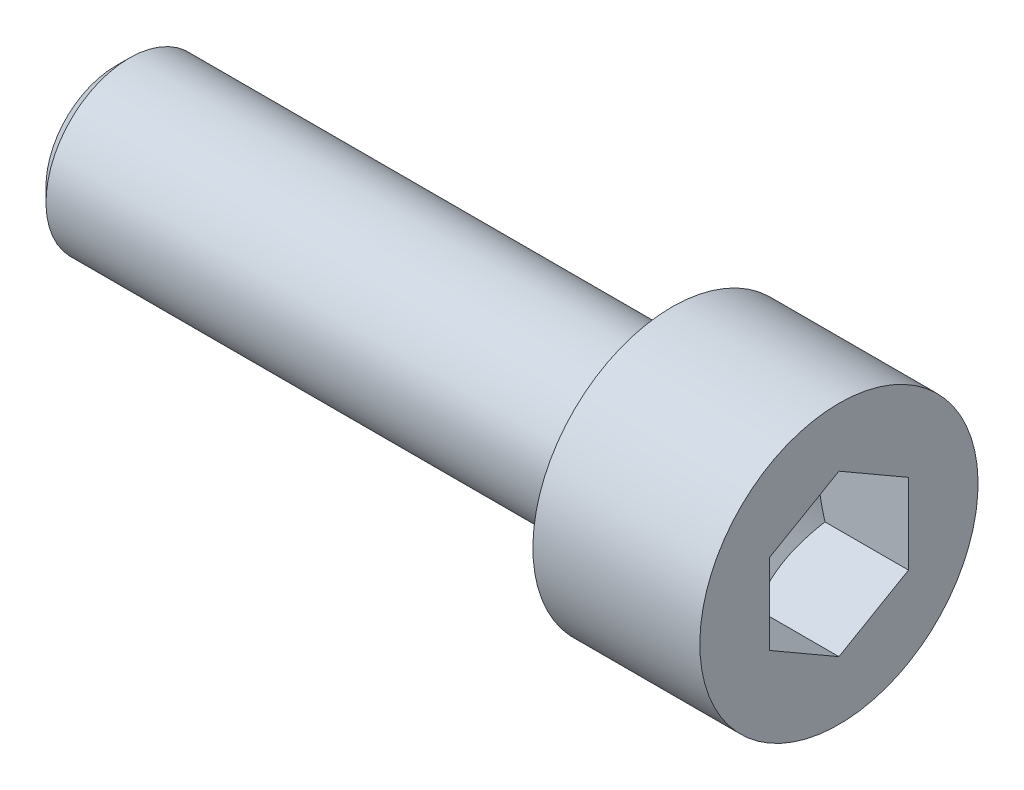
ISO-10303-21;
HEADER;
FILE_DESCRIPTION(('STEP AP214'),'2;1');
FILE_NAME('part.step','',(''),(''),'','','');
FILE_SCHEMA(('AUTOMOTIVE_DESIGN { 1 0 10303 214 1 1 1 1 }'));
ENDSEC;
DATA;
#1=APPLICATION_CONTEXT('core data for automotive mechanical design processes');
#2=APPLICATION_PROTOCOL_DEFINITION('international standard','automotive_design',2000,#1);
#3=PRODUCT_CONTEXT('',#1,'mechanical');
#4=PRODUCT('Part','Part','',(#3));
#5=PRODUCT_RELATED_PRODUCT_CATEGORY('part','',(#4));
#6=PRODUCT_DEFINITION_FORMATION('','',#4);
#7=PRODUCT_DEFINITION_CONTEXT('part definition',#1,'design');
#8=PRODUCT_DEFINITION('design','',#6,#7);
#9=PRODUCT_DEFINITION_SHAPE('','',#8);
#10=(LENGTH_UNIT() NAMED_UNIT(*) SI_UNIT(.MILLI.,.METRE.));
#11=(NAMED_UNIT(*) PLANE_ANGLE_UNIT() SI_UNIT($,.RADIAN.));
#12=(NAMED_UNIT(*) SI_UNIT($,.STERADIAN.) SOLID_ANGLE_UNIT());
#13=UNCERTAINTY_MEASURE_WITH_UNIT(LENGTH_MEASURE(1.E-05),#10,'distance_accuracy_value','');
#14=(GEOMETRIC_REPRESENTATION_CONTEXT(3) GLOBAL_UNCERTAINTY_ASSIGNED_CONTEXT((#13)) GLOBAL_UNIT_ASSIGNED_CONTEXT((#10,
#11,#12)) REPRESENTATION_CONTEXT('',''));
#15=CARTESIAN_POINT('',(0.,0.,0.));
#16=DIRECTION('',(0.,0.,1.));
#17=DIRECTION('',(1.,0.,0.));
#18=AXIS2_PLACEMENT_3D('',#15,#16,#17);
#19=CARTESIAN_POINT('',(-25.9,0.,0.));
#20=DIRECTION('',(1.,0.,0.));
#21=DIRECTION('',(0.,1.,0.));
#22=AXIS2_PLACEMENT_3D('',#19,#20,#21);
#23=CYLINDRICAL_SURFACE('',#22,2.5);
#24=CARTESIAN_POINT('',(-6.92,0.,0.));
#25=DIRECTION('',(1.,0.,0.));
#26=DIRECTION('',(0.,1.,0.));
#27=AXIS2_PLACEMENT_3D('',#24,#25,#26);
#28=CIRCLE('',#27,2.5);
#29=CARTESIAN_POINT('',(-6.92,2.5,0.));
#30=VERTEX_POINT('',#29);
#31=EDGE_CURVE('P0_E11',#30,#30,#28,.T.);
#32=ORIENTED_EDGE('',*,*,#31,.T.);
#33=EDGE_LOOP('',(#32));
#34=FACE_BOUND('',#33,.T.);
#35=CARTESIAN_POINT('',(-25.9,0.,0.));
#36=DIRECTION('',(1.,0.,0.));
#37=DIRECTION('',(0.,1.,0.));
#38=AXIS2_PLACEMENT_3D('',#35,#36,#37);
#39=CIRCLE('',#38,2.5);
#40=CARTESIAN_POINT('',(-25.9,2.5,0.));
#41=VERTEX_POINT('',#40);
#42=EDGE_CURVE('P0_E53',#41,#41,#39,.T.);
#43=ORIENTED_EDGE('',*,*,#42,.F.);
#44=EDGE_LOOP('',(#43));
#45=FACE_BOUND('',#44,.T.);
#46=ADVANCED_FACE('P0_F16',(#34,#45),#23,.F.);
#47=CARTESIAN_POINT('',(-6.92,-3.30000000001571,-3.30000000001571));
#48=DIRECTION('',(1.,0.,0.));
#49=DIRECTION('',(0.,1.,0.));
#50=AXIS2_PLACEMENT_3D('',#47,#48,#49);
#51=PLANE('',#50);
#52=CARTESIAN_POINT('',(-6.92,0.,0.));
#53=DIRECTION('',(1.,0.,0.));
#54=DIRECTION('',(0.,1.,0.));
#55=AXIS2_PLACEMENT_3D('',#52,#53,#54);
#56=CIRCLE('',#55,3.00000000001428);
#57=CARTESIAN_POINT('',(-6.92,3.00000000001428,0.));
#58=VERTEX_POINT('',#57);
#59=EDGE_CURVE('P0_E24',#58,#58,#56,.T.);
#60=ORIENTED_EDGE('',*,*,#59,.T.);
#61=EDGE_LOOP('',(#60));
#62=FACE_BOUND('',#61,.T.);
#63=ORIENTED_EDGE('',*,*,#31,.F.);
#64=EDGE_LOOP('',(#63));
#65=FACE_BOUND('',#64,.T.);
#66=ADVANCED_FACE('P0_F78',(#62,#65),#51,.T.);
#67=CARTESIAN_POINT('',(-25.3999999999858,0.,0.));
#68=DIRECTION('',(1.,0.,0.));
#69=DIRECTION('',(0.,1.,0.));
#70=AXIS2_PLACEMENT_3D('',#67,#68,#69);
#71=CYLINDRICAL_SURFACE('',#70,3.00000000001429);
#72=CARTESIAN_POINT('',(-25.3999999999858,0.,0.));
#73=DIRECTION('',(-1.,0.,0.));
#74=DIRECTION('',(0.,1.,0.));
#75=AXIS2_PLACEMENT_3D('',#72,#73,#74);
#76=CIRCLE('',#75,3.00000000001431);
#77=CARTESIAN_POINT('',(-25.3999999999858,3.00000000001431,0.));
#78=VERTEX_POINT('',#77);
#79=EDGE_CURVE('P0_E49',#78,#78,#76,.T.);
#80=ORIENTED_EDGE('',*,*,#79,.F.);
#81=EDGE_LOOP('',(#80));
#82=FACE_BOUND('',#81,.T.);
#83=ORIENTED_EDGE('',*,*,#59,.F.);
#84=EDGE_LOOP('',(#83));
#85=FACE_BOUND('',#84,.T.);
#86=ADVANCED_FACE('P0_F69',(#82,#85),#71,.T.);
#87=CARTESIAN_POINT('',(-25.9,0.,0.));
#88=DIRECTION('',(1.,0.,0.));
#89=DIRECTION('',(0.,1.,0.));
#90=AXIS2_PLACEMENT_3D('',#87,#88,#89);
#91=CONICAL_SURFACE('',#90,2.5,0.78539816250006);
#92=ORIENTED_EDGE('',*,*,#42,.T.);
#93=EDGE_LOOP('',(#92));
#94=FACE_BOUND('',#93,.T.);
#95=ORIENTED_EDGE('',*,*,#79,.T.);
#96=EDGE_LOOP('',(#95));
#97=FACE_BOUND('',#96,.T.);
#98=ADVANCED_FACE('P0_F50',(#94,#97),#91,.T.);
#99=CLOSED_SHELL('',(#46,#66,#86,#98));
#100=MANIFOLD_SOLID_BREP('P0_B1',#99);
#101=CARTESIAN_POINT('',(-6.92,-2.728,-2.728));
#102=DIRECTION('',(1.,0.,0.));
#103=DIRECTION('',(0.,1.,0.));
#104=AXIS2_PLACEMENT_3D('',#101,#102,#103);
#105=PLANE('',#104);
#106=CARTESIAN_POINT('',(-6.92,0.,0.));
#107=DIRECTION('',(1.,0.,0.));
#108=DIRECTION('',(0.,1.,0.));
#109=AXIS2_PLACEMENT_3D('',#106,#107,#108);
#110=CIRCLE('',#109,2.48);
#111=CARTESIAN_POINT('',(-6.92,2.48,0.));
#112=VERTEX_POINT('',#111);
#113=EDGE_CURVE('P1_E11',#112,#112,#110,.T.);
#114=ORIENTED_EDGE('',*,*,#113,.T.);
#115=EDGE_LOOP('',(#114));
#116=FACE_BOUND('',#115,.T.);
#117=ADVANCED_FACE('P1_F16',(#116),#105,.T.);
#118=CARTESIAN_POINT('',(-25.9,0.,0.));
#119=DIRECTION('',(1.,0.,0.));
#120=DIRECTION('',(0.,1.,0.));
#121=AXIS2_PLACEMENT_3D('',#118,#119,#120);
#122=CYLINDRICAL_SURFACE('',#121,2.48);
#123=CARTESIAN_POINT('',(-25.9,0.,0.));
#124=DIRECTION('',(-1.,0.,0.));
#125=DIRECTION('',(0.,1.,0.));
#126=AXIS2_PLACEMENT_3D('',#123,#124,#125);
#127=CIRCLE('',#126,2.48);
#128=CARTESIAN_POINT('',(-25.9,2.48,0.));
#129=VERTEX_POINT('',#128);
#130=EDGE_CURVE('P1_E24',#129,#129,#127,.T.);
#131=ORIENTED_EDGE('',*,*,#130,.F.);
#132=EDGE_LOOP('',(#131));
#133=FACE_BOUND('',#132,.T.);
#134=ORIENTED_EDGE('',*,*,#113,.F.);
#135=EDGE_LOOP('',(#134));
#136=FACE_BOUND('',#135,.T.);
#137=ADVANCED_FACE('P1_F50',(#133,#136),#122,.T.);
#138=CARTESIAN_POINT('',(-25.9,-2.728,2.728));
#139=DIRECTION('',(-1.,0.,0.));
#140=DIRECTION('',(0.,0.,1.));
#141=AXIS2_PLACEMENT_3D('',#138,#139,#140);
#142=PLANE('',#141);
#143=ORIENTED_EDGE('',*,*,#130,.T.);
#144=EDGE_LOOP('',(#143));
#145=FACE_BOUND('',#144,.T.);
#146=ADVANCED_FACE('P1_F38',(#145),#142,.T.);
#147=CLOSED_SHELL('',(#117,#137,#146));
#148=MANIFOLD_SOLID_BREP('P1_B1',#147);
#149=CARTESIAN_POINT('',(0.0999999999999716,1.44337567297414,2.50000000000008));
#150=DIRECTION('',(0.,0.866025403784447,0.499999999999986));
#151=DIRECTION('',(1.,0.,0.));
#152=AXIS2_PLACEMENT_3D('',#149,#150,#151);
#153=PLANE('',#152);
#154=DIRECTION('',(-1.,0.,0.));
#155=VECTOR('',#154,1.);
#156=CARTESIAN_POINT('',(0.0999999999999751,2.88675134594819,0.));
#157=LINE('',#156,#155);
#158=CARTESIAN_POINT('',(0.0999999999999751,2.88675134594814,0.));
#159=VERTEX_POINT('',#158);
#160=CARTESIAN_POINT('',(-2.9,2.88675134594818,0.));
#161=VERTEX_POINT('',#160);
#162=EDGE_CURVE('P2_E203',#159,#161,#157,.T.);
#163=ORIENTED_EDGE('',*,*,#162,.F.);
#164=DIRECTION('',(0.,0.499999999999992,-0.866025403784444));
#165=VECTOR('',#164,1.);
#166=CARTESIAN_POINT('',(0.0999999999999751,1.44337567297417,2.50000000000005));
#167=LINE('',#166,#165);
#168=CARTESIAN_POINT('',(0.0999999999999751,1.44337567297414,2.50000000000008));
#169=VERTEX_POINT('',#168);
#170=EDGE_CURVE('P2_E164',#169,#159,#167,.T.);
#171=ORIENTED_EDGE('',*,*,#170,.F.);
#172=DIRECTION('',(1.,0.,0.));
#173=VECTOR('',#172,1.);
#174=CARTESIAN_POINT('',(-2.9,1.44337567297417,2.50000000000005));
#175=LINE('',#174,#173);
#176=CARTESIAN_POINT('',(-2.9,1.44337567297414,2.50000000000008));
#177=VERTEX_POINT('',#176);
#178=EDGE_CURVE('P2_E174',#177,#169,#175,.T.);
#179=ORIENTED_EDGE('',*,*,#178,.F.);
#180=CARTESIAN_POINT('',(-2.9,2.88675134594823,0.));
#181=CARTESIAN_POINT('',(-3.3376297113811,2.1650635094612,1.25000000000003));
#182=CARTESIAN_POINT('',(-2.90000000000004,1.44337567297417,2.50000000000006));
#183=(BOUNDED_CURVE() B_SPLINE_CURVE(2,(#180,#181,#182),.UNSPECIFIED.,.F.,
.F.) B_SPLINE_CURVE_WITH_KNOTS((3,3),(0.,1.),
.UNSPECIFIED.) CURVE() GEOMETRIC_REPRESENTATION_ITEM() RATIONAL_B_SPLINE_CURVE((1.,
1.15470053837925,1.)) REPRESENTATION_ITEM(''));
#184=EDGE_CURVE('P2_E11',#161,#177,#183,.T.);
#185=ORIENTED_EDGE('',*,*,#184,.F.);
#186=EDGE_LOOP('',(#163,#171,#179,#185));
#187=FACE_BOUND('',#186,.T.);
#188=ADVANCED_FACE('P2_F16',(#187),#153,.F.);
#189=CARTESIAN_POINT('',(-3.65051884552429,0.,0.));
#190=DIRECTION('',(1.,0.,0.));
#191=DIRECTION('',(0.,1.,0.));
#192=AXIS2_PLACEMENT_3D('',#189,#190,#191);
#193=CONICAL_SURFACE('',#192,1.64908326791112,1.02568604338406);
#194=CARTESIAN_POINT('',(-2.9,1.44337567297399,-2.5000000000001));
#195=CARTESIAN_POINT('',(-3.33762971138116,2.16506350946111,-1.24999999999997));
#196=CARTESIAN_POINT('',(-2.9,2.88675134594823,1.51788304147971E-13));
#197=(BOUNDED_CURVE() B_SPLINE_CURVE(2,(#194,#195,#196),.UNSPECIFIED.,.F.,
.F.) B_SPLINE_CURVE_WITH_KNOTS((3,3),(0.,1.),
.UNSPECIFIED.) CURVE() GEOMETRIC_REPRESENTATION_ITEM() RATIONAL_B_SPLINE_CURVE((1.,
1.15470053837929,1.)) REPRESENTATION_ITEM(''));
#198=CARTESIAN_POINT('',(-2.9,1.44337567297403,-2.49999999999991));
#199=VERTEX_POINT('',#198);
#200=EDGE_CURVE('P2_E27',#199,#161,#197,.T.);
#201=ORIENTED_EDGE('',*,*,#200,.T.);
#202=ORIENTED_EDGE('',*,*,#184,.T.);
#203=CARTESIAN_POINT('',(-2.90000000000004,1.44337567297418,2.50000000000005));
#204=CARTESIAN_POINT('',(-3.33762971138111,1.02908550013496E-13,2.50000000000008));
#205=CARTESIAN_POINT('',(-2.90000000000006,-1.44337567297398,2.50000000000011));
#206=(BOUNDED_CURVE() B_SPLINE_CURVE(2,(#203,#204,#205),.UNSPECIFIED.,.F.,
.F.) B_SPLINE_CURVE_WITH_KNOTS((3,3),(0.,1.),
.UNSPECIFIED.) CURVE() GEOMETRIC_REPRESENTATION_ITEM() RATIONAL_B_SPLINE_CURVE((1.,
1.15470053837925,1.)) REPRESENTATION_ITEM(''));
#207=CARTESIAN_POINT('',(-2.9,-1.44337567297403,2.50000000000016));
#208=VERTEX_POINT('',#207);
#209=EDGE_CURVE('P2_E180',#177,#208,#206,.T.);
#210=ORIENTED_EDGE('',*,*,#209,.T.);
#211=CARTESIAN_POINT('',(-2.90000000000006,-1.44337567297402,2.50000000000009));
#212=CARTESIAN_POINT('',(-3.33762971138113,-2.16506350946107,1.25000000000006));
#213=CARTESIAN_POINT('',(-2.90000000000006,-2.88675134594813,0.));
#214=(BOUNDED_CURVE() B_SPLINE_CURVE(2,(#211,#212,#213),.UNSPECIFIED.,.F.,
.F.) B_SPLINE_CURVE_WITH_KNOTS((3,3),(0.,1.),
.UNSPECIFIED.) CURVE() GEOMETRIC_REPRESENTATION_ITEM() RATIONAL_B_SPLINE_CURVE((1.,
1.15470053837925,1.)) REPRESENTATION_ITEM(''));
#215=CARTESIAN_POINT('',(-2.9,-2.88675134594812,1.76074432811646E-13));
#216=VERTEX_POINT('',#215);
#217=EDGE_CURVE('P2_E142',#208,#216,#214,.T.);
#218=ORIENTED_EDGE('',*,*,#217,.T.);
#219=CARTESIAN_POINT('',(-2.90000000000006,-2.88675134594813,2.21177243187043E-13));
#220=CARTESIAN_POINT('',(-3.33762971138119,-2.16506350946102,-1.24999999999993));
#221=CARTESIAN_POINT('',(-2.90000000000004,-1.44337567297394,-2.50000000000007));
#222=(BOUNDED_CURVE() B_SPLINE_CURVE(2,(#219,#220,#221),.UNSPECIFIED.,.F.,
.F.) B_SPLINE_CURVE_WITH_KNOTS((3,3),(0.,1.),
.UNSPECIFIED.) CURVE() GEOMETRIC_REPRESENTATION_ITEM() RATIONAL_B_SPLINE_CURVE((1.,
1.15470053837929,1.)) REPRESENTATION_ITEM(''));
#223=CARTESIAN_POINT('',(-2.9,-1.44337567297409,-2.49999999999987));
#224=VERTEX_POINT('',#223);
#225=EDGE_CURVE('P2_E141',#216,#224,#222,.T.);
#226=ORIENTED_EDGE('',*,*,#225,.T.);
#227=CARTESIAN_POINT('',(-2.90000000000004,-1.44337567297422,-2.49999999999991));
#228=CARTESIAN_POINT('',(-3.33762971138119,0.,-2.49999999999993));
#229=CARTESIAN_POINT('',(-2.9,1.44337567297426,-2.49999999999994));
#230=(BOUNDED_CURVE() B_SPLINE_CURVE(2,(#227,#228,#229),.UNSPECIFIED.,.F.,
.F.) B_SPLINE_CURVE_WITH_KNOTS((3,3),(0.,1.),
.UNSPECIFIED.) CURVE() GEOMETRIC_REPRESENTATION_ITEM() RATIONAL_B_SPLINE_CURVE((1.,
1.15470053837929,1.)) REPRESENTATION_ITEM(''));
#231=EDGE_CURVE('P2_E138',#224,#199,#230,.T.);
#232=ORIENTED_EDGE('',*,*,#231,.T.);
#233=EDGE_LOOP('',(#201,#202,#210,#218,#226,#232));
#234=FACE_BOUND('',#233,.T.);
#235=CARTESIAN_POINT('',(-4.6505188455243,0.,0.));
#236=VERTEX_POINT('',#235);
#237=VERTEX_LOOP('',#236);
#238=FACE_BOUND('',#237,.T.);
#239=ADVANCED_FACE('P2_F104',(#234,#238),#193,.F.);
#240=CARTESIAN_POINT('',(0.0999999999999716,2.88675134594814,0.));
#241=DIRECTION('',(0.,0.866025403784432,-0.500000000000012));
#242=DIRECTION('',(-1.,0.,0.));
#243=AXIS2_PLACEMENT_3D('',#240,#241,#242);
#244=PLANE('',#243);
#245=DIRECTION('',(1.,0.,0.));
#246=VECTOR('',#245,1.);
#247=CARTESIAN_POINT('',(-2.9,1.44337567297408,-2.49999999999994));
#248=LINE('',#247,#246);
#249=CARTESIAN_POINT('',(0.0999999999999751,1.44337567297403,-2.49999999999991));
#250=VERTEX_POINT('',#249);
#251=EDGE_CURVE('P2_E193',#199,#250,#248,.T.);
#252=ORIENTED_EDGE('',*,*,#251,.T.);
#253=DIRECTION('',(0.,-0.500000000000007,-0.866025403784435));
#254=VECTOR('',#253,1.);
#255=CARTESIAN_POINT('',(0.0999999999999751,2.88675134594819,0.));
#256=LINE('',#255,#254);
#257=EDGE_CURVE('P2_E157',#159,#250,#256,.T.);
#258=ORIENTED_EDGE('',*,*,#257,.F.);
#259=ORIENTED_EDGE('',*,*,#162,.T.);
#260=ORIENTED_EDGE('',*,*,#200,.F.);
#261=EDGE_LOOP('',(#252,#258,#259,#260));
#262=FACE_BOUND('',#261,.T.);
#263=ADVANCED_FACE('P2_F106',(#262),#244,.F.);
#264=CARTESIAN_POINT('',(0.0999999999999716,1.44337567297403,-2.49999999999991));
#265=DIRECTION('',(0.,0.,-1.));
#266=DIRECTION('',(0.,-1.,0.));
#267=AXIS2_PLACEMENT_3D('',#264,#265,#266);
#268=PLANE('',#267);
#269=DIRECTION('',(1.,0.,0.));
#270=VECTOR('',#269,1.);
#271=CARTESIAN_POINT('',(-2.9,-1.44337567297403,-2.49999999999991));
#272=LINE('',#271,#270);
#273=CARTESIAN_POINT('',(0.0999999999999751,-1.44337567297409,-2.49999999999987));
#274=VERTEX_POINT('',#273);
#275=EDGE_CURVE('P2_E131',#224,#274,#272,.T.);
#276=ORIENTED_EDGE('',*,*,#275,.T.);
#277=DIRECTION('',(0.,-1.,0.));
#278=VECTOR('',#277,1.);
#279=CARTESIAN_POINT('',(0.0999999999999751,1.44337567297408,-2.49999999999994));
#280=LINE('',#279,#278);
#281=EDGE_CURVE('P2_E135',#250,#274,#280,.T.);
#282=ORIENTED_EDGE('',*,*,#281,.F.);
#283=ORIENTED_EDGE('',*,*,#251,.F.);
#284=ORIENTED_EDGE('',*,*,#231,.F.);
#285=EDGE_LOOP('',(#276,#282,#283,#284));
#286=FACE_BOUND('',#285,.T.);
#287=ADVANCED_FACE('P2_F115',(#286),#268,.F.);
#288=CARTESIAN_POINT('',(0.0999999999999716,-1.44337567297409,-2.49999999999987));
#289=DIRECTION('',(0.,-0.866025403784448,-0.499999999999984));
#290=DIRECTION('',(0.,0.499999999999984,-0.866025403784448));
#291=AXIS2_PLACEMENT_3D('',#288,#289,#290);
#292=PLANE('',#291);
#293=DIRECTION('',(1.,0.,0.));
#294=VECTOR('',#293,1.);
#295=CARTESIAN_POINT('',(-2.9,-2.88675134594808,0.));
#296=LINE('',#295,#294);
#297=CARTESIAN_POINT('',(0.0999999999999751,-2.88675134594812,1.76074432811646E-13));
#298=VERTEX_POINT('',#297);
#299=EDGE_CURVE('P2_E147',#216,#298,#296,.T.);
#300=ORIENTED_EDGE('',*,*,#299,.T.);
#301=DIRECTION('',(0.,-0.499999999999989,0.866025403784445));
#302=VECTOR('',#301,1.);
#303=CARTESIAN_POINT('',(0.0999999999999751,-1.44337567297403,-2.49999999999991));
#304=LINE('',#303,#302);
#305=EDGE_CURVE('P2_E145',#274,#298,#304,.T.);
#306=ORIENTED_EDGE('',*,*,#305,.F.);
#307=ORIENTED_EDGE('',*,*,#275,.F.);
#308=ORIENTED_EDGE('',*,*,#225,.F.);
#309=EDGE_LOOP('',(#300,#306,#307,#308));
#310=FACE_BOUND('',#309,.T.);
#311=ADVANCED_FACE('P2_F119',(#310),#292,.F.);
#312=CARTESIAN_POINT('',(0.0999999999999716,-2.88675134594812,1.76074432811646E-13));
#313=DIRECTION('',(0.,-0.866025403784433,0.500000000000009));
#314=DIRECTION('',(-1.,0.,0.));
#315=AXIS2_PLACEMENT_3D('',#312,#313,#314);
#316=PLANE('',#315);
#317=DIRECTION('',(1.,0.,0.));
#318=VECTOR('',#317,1.);
#319=CARTESIAN_POINT('',(-2.9,-1.443375672974,2.50000000000011));
#320=LINE('',#319,#318);
#321=CARTESIAN_POINT('',(0.0999999999999751,-1.44337567297403,2.50000000000016));
#322=VERTEX_POINT('',#321);
#323=EDGE_CURVE('P2_E176',#208,#322,#320,.T.);
#324=ORIENTED_EDGE('',*,*,#323,.T.);
#325=DIRECTION('',(0.,0.5,0.866025403784436));
#326=VECTOR('',#325,1.);
#327=CARTESIAN_POINT('',(0.0999999999999751,-2.88675134594808,1.22298005056365E-13));
#328=LINE('',#327,#326);
#329=EDGE_CURVE('P2_E152',#298,#322,#328,.T.);
#330=ORIENTED_EDGE('',*,*,#329,.F.);
#331=ORIENTED_EDGE('',*,*,#299,.F.);
#332=ORIENTED_EDGE('',*,*,#217,.F.);
#333=EDGE_LOOP('',(#324,#330,#331,#332));
#334=FACE_BOUND('',#333,.T.);
#335=ADVANCED_FACE('P2_F127',(#334),#316,.F.);
#336=CARTESIAN_POINT('',(0.0999999999999716,-1.44337567297403,2.50000000000016));
#337=DIRECTION('',(0.,0.,1.));
#338=DIRECTION('',(0.,-1.,0.));
#339=AXIS2_PLACEMENT_3D('',#336,#337,#338);
#340=PLANE('',#339);
#341=ORIENTED_EDGE('',*,*,#178,.T.);
#342=DIRECTION('',(0.,1.,0.));
#343=VECTOR('',#342,1.);
#344=CARTESIAN_POINT('',(0.0999999999999751,-1.443375672974,2.50000000000011));
#345=LINE('',#344,#343);
#346=EDGE_CURVE('P2_E173',#322,#169,#345,.T.);
#347=ORIENTED_EDGE('',*,*,#346,.F.);
#348=ORIENTED_EDGE('',*,*,#323,.F.);
#349=ORIENTED_EDGE('',*,*,#209,.F.);
#350=EDGE_LOOP('',(#341,#347,#348,#349));
#351=FACE_BOUND('',#350,.T.);
#352=ADVANCED_FACE('P2_F251',(#351),#340,.F.);
#353=CARTESIAN_POINT('',(0.0999999999999716,-5.5,-5.5));
#354=DIRECTION('',(1.,0.,0.));
#355=DIRECTION('',(0.,1.,0.));
#356=AXIS2_PLACEMENT_3D('',#353,#354,#355);
#357=PLANE('',#356);
#358=CARTESIAN_POINT('',(0.0999999999999716,0.,0.));
#359=DIRECTION('',(1.,0.,0.));
#360=DIRECTION('',(0.,1.,0.));
#361=AXIS2_PLACEMENT_3D('',#358,#359,#360);
#362=CIRCLE('',#361,5.);
#363=CARTESIAN_POINT('',(0.0999999999999716,5.,0.));
#364=VERTEX_POINT('',#363);
#365=EDGE_CURVE('P2_E168',#364,#364,#362,.T.);
#366=ORIENTED_EDGE('',*,*,#365,.T.);
#367=EDGE_LOOP('',(#366));
#368=FACE_BOUND('',#367,.T.);
#369=ORIENTED_EDGE('',*,*,#170,.T.);
#370=ORIENTED_EDGE('',*,*,#257,.T.);
#371=ORIENTED_EDGE('',*,*,#281,.T.);
#372=ORIENTED_EDGE('',*,*,#305,.T.);
#373=ORIENTED_EDGE('',*,*,#329,.T.);
#374=ORIENTED_EDGE('',*,*,#346,.T.);
#375=EDGE_LOOP('',(#369,#370,#371,#372,#373,#374));
#376=FACE_BOUND('',#375,.T.);
#377=ADVANCED_FACE('P2_F155',(#368,#376),#357,.T.);
#378=CARTESIAN_POINT('',(-5.9,0.,0.));
#379=DIRECTION('',(1.,0.,0.));
#380=DIRECTION('',(0.,1.,0.));
#381=AXIS2_PLACEMENT_3D('',#378,#379,#380);
#382=CYLINDRICAL_SURFACE('',#381,5.);
#383=CARTESIAN_POINT('',(-5.9,0.,0.));
#384=DIRECTION('',(1.,0.,0.));
#385=DIRECTION('',(0.,1.,0.));
#386=AXIS2_PLACEMENT_3D('',#383,#384,#385);
#387=CIRCLE('',#386,5.);
#388=CARTESIAN_POINT('',(-5.9,5.,0.));
#389=VERTEX_POINT('',#388);
#390=EDGE_CURVE('P2_E230',#389,#389,#387,.T.);
#391=ORIENTED_EDGE('',*,*,#390,.T.);
#392=EDGE_LOOP('',(#391));
#393=FACE_BOUND('',#392,.T.);
#394=ORIENTED_EDGE('',*,*,#365,.F.);
#395=EDGE_LOOP('',(#394));
#396=FACE_BOUND('',#395,.T.);
#397=ADVANCED_FACE('P2_F258',(#393,#396),#382,.T.);
#398=CARTESIAN_POINT('',(-5.9,-5.5,5.5));
#399=DIRECTION('',(-1.,0.,0.));
#400=DIRECTION('',(0.,0.,1.));
#401=AXIS2_PLACEMENT_3D('',#398,#399,#400);
#402=PLANE('',#401);
#403=ORIENTED_EDGE('',*,*,#390,.F.);
#404=EDGE_LOOP('',(#403));
#405=FACE_BOUND('',#404,.T.);
#406=CARTESIAN_POINT('',(-5.9,0.,0.));
#407=DIRECTION('',(1.,0.,0.));
#408=DIRECTION('',(0.,1.,0.));
#409=AXIS2_PLACEMENT_3D('',#406,#407,#408);
#410=CIRCLE('',#409,3.00000000001426);
#411=CARTESIAN_POINT('',(-5.9,3.00000000001426,0.));
#412=VERTEX_POINT('',#411);
#413=EDGE_CURVE('P2_E231',#412,#412,#410,.T.);
#414=ORIENTED_EDGE('',*,*,#413,.T.);
#415=EDGE_LOOP('',(#414));
#416=FACE_BOUND('',#415,.T.);
#417=ADVANCED_FACE('P2_F265',(#405,#416),#402,.T.);
#418=CARTESIAN_POINT('',(-6.9,0.,0.));
#419=DIRECTION('',(1.,0.,0.));
#420=DIRECTION('',(0.,1.,0.));
#421=AXIS2_PLACEMENT_3D('',#418,#419,#420);
#422=CYLINDRICAL_SURFACE('',#421,3.00000000001427);
#423=CARTESIAN_POINT('',(-6.9,0.,0.));
#424=DIRECTION('',(1.,0.,0.));
#425=DIRECTION('',(0.,1.,0.));
#426=AXIS2_PLACEMENT_3D('',#423,#424,#425);
#427=CIRCLE('',#426,3.00000000001428);
#428=CARTESIAN_POINT('',(-6.9,3.00000000001428,0.));
#429=VERTEX_POINT('',#428);
#430=EDGE_CURVE('P2_E99',#429,#429,#427,.T.);
#431=ORIENTED_EDGE('',*,*,#430,.T.);
#432=EDGE_LOOP('',(#431));
#433=FACE_BOUND('',#432,.T.);
#434=ORIENTED_EDGE('',*,*,#413,.F.);
#435=EDGE_LOOP('',(#434));
#436=FACE_BOUND('',#435,.T.);
#437=ADVANCED_FACE('P2_F268',(#433,#436),#422,.T.);
#438=CARTESIAN_POINT('',(-6.9,-3.30000000001571,3.30000000001571));
#439=DIRECTION('',(-1.,0.,0.));
#440=DIRECTION('',(0.,0.,1.));
#441=AXIS2_PLACEMENT_3D('',#438,#439,#440);
#442=PLANE('',#441);
#443=ORIENTED_EDGE('',*,*,#430,.F.);
#444=EDGE_LOOP('',(#443));
#445=FACE_BOUND('',#444,.T.);
#446=ADVANCED_FACE('P2_F271',(#445),#442,.T.);
#447=CLOSED_SHELL('',(#188,#239,#263,#287,#311,#335,#352,#377,#397,#417,#437,#446));
#448=MANIFOLD_SOLID_BREP('P2_B1',#447);
#449=ADVANCED_BREP_SHAPE_REPRESENTATION('',(#18,#100,#148,#448),#14);
#450=SHAPE_DEFINITION_REPRESENTATION(#9,#449);
ENDSEC;
END-ISO-10303-21;
